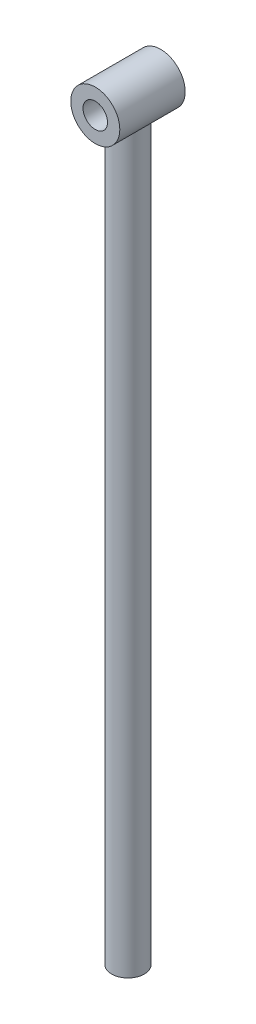
ISO-10303-21;
HEADER;
FILE_DESCRIPTION(('STEP AP214'),'2;1');
FILE_NAME('part.step','',(''),(''),'','','');
FILE_SCHEMA(('AUTOMOTIVE_DESIGN { 1 0 10303 214 1 1 1 1 }'));
ENDSEC;
DATA;
#1=APPLICATION_CONTEXT('core data for automotive mechanical design processes');
#2=APPLICATION_PROTOCOL_DEFINITION('international standard','automotive_design',2000,#1);
#3=PRODUCT_CONTEXT('',#1,'mechanical');
#4=PRODUCT('Part','Part','',(#3));
#5=PRODUCT_RELATED_PRODUCT_CATEGORY('part','',(#4));
#6=PRODUCT_DEFINITION_FORMATION('','',#4);
#7=PRODUCT_DEFINITION_CONTEXT('part definition',#1,'design');
#8=PRODUCT_DEFINITION('design','',#6,#7);
#9=PRODUCT_DEFINITION_SHAPE('','',#8);
#10=(LENGTH_UNIT() NAMED_UNIT(*) SI_UNIT(.MILLI.,.METRE.));
#11=(NAMED_UNIT(*) PLANE_ANGLE_UNIT() SI_UNIT($,.RADIAN.));
#12=(NAMED_UNIT(*) SI_UNIT($,.STERADIAN.) SOLID_ANGLE_UNIT());
#13=UNCERTAINTY_MEASURE_WITH_UNIT(LENGTH_MEASURE(1.E-05),#10,'distance_accuracy_value','');
#14=(GEOMETRIC_REPRESENTATION_CONTEXT(3) GLOBAL_UNCERTAINTY_ASSIGNED_CONTEXT((#13)) GLOBAL_UNIT_ASSIGNED_CONTEXT((#10,
#11,#12)) REPRESENTATION_CONTEXT('',''));
#15=CARTESIAN_POINT('',(0.,0.,0.));
#16=DIRECTION('',(0.,0.,1.));
#17=DIRECTION('',(1.,0.,0.));
#18=AXIS2_PLACEMENT_3D('',#15,#16,#17);
#19=CARTESIAN_POINT('',(0.,0.,40.));
#20=DIRECTION('',(0.,0.,-1.));
#21=DIRECTION('',(-1.,0.,0.));
#22=AXIS2_PLACEMENT_3D('',#19,#20,#21);
#23=CYLINDRICAL_SURFACE('',#22,30.);
#24=CARTESIAN_POINT('',(0.,0.,40.));
#25=DIRECTION('',(0.,0.,1.));
#26=DIRECTION('',(1.,0.,0.));
#27=AXIS2_PLACEMENT_3D('',#24,#25,#26);
#28=CIRCLE('',#27,30.);
#29=CARTESIAN_POINT('',(30.,0.,40.));
#30=VERTEX_POINT('',#29);
#31=EDGE_CURVE('E46',#30,#30,#28,.T.);
#32=ORIENTED_EDGE('',*,*,#31,.F.);
#33=EDGE_LOOP('',(#32));
#34=FACE_BOUND('',#33,.T.);
#35=CARTESIAN_POINT('',(0.,0.,-40.));
#36=DIRECTION('',(0.,0.,1.));
#37=DIRECTION('',(1.,0.,0.));
#38=AXIS2_PLACEMENT_3D('',#35,#36,#37);
#39=CIRCLE('',#38,30.);
#40=CARTESIAN_POINT('',(30.,0.,-40.));
#41=VERTEX_POINT('',#40);
#42=EDGE_CURVE('E50',#41,#41,#39,.T.);
#43=ORIENTED_EDGE('',*,*,#42,.T.);
#44=EDGE_LOOP('',(#43));
#45=FACE_BOUND('',#44,.T.);
#46=CARTESIAN_POINT('',(0.,-30.,-20.));
#47=CARTESIAN_POINT('',(0.502432050357106,-29.9999998661981,-19.9999998708156));
#48=CARTESIAN_POINT('',(1.00486659291617,-29.9873512767924,-19.981041890221));
#49=CARTESIAN_POINT('',(2.00562861223446,-29.9370754507124,-19.9055087079442));
#50=CARTESIAN_POINT('',(2.50395606736271,-29.8994480825663,-19.8489333082686));
#51=CARTESIAN_POINT('',(3.49278874290095,-29.8001252135495,-19.6990002879968));
#52=CARTESIAN_POINT('',(3.98329083644028,-29.7384203306489,-19.6056283291341));
#53=CARTESIAN_POINT('',(4.9527367018995,-29.5924098661005,-19.3834395211629));
#54=CARTESIAN_POINT('',(5.43168033398314,-29.5081040111715,-19.2546222434644));
#55=CARTESIAN_POINT('',(6.3726831529905,-29.3192451350848,-18.9639204802124));
#56=CARTESIAN_POINT('',(6.83481207132658,-29.2147907649452,-18.8021969068242));
#57=CARTESIAN_POINT('',(7.74207070686117,-28.987567335659,-18.4471586375469));
#58=CARTESIAN_POINT('',(8.18720051199242,-28.864798371266,-18.2538441050984));
#59=CARTESIAN_POINT('',(9.05844037609498,-28.6033482003015,-17.8375381124749));
#60=CARTESIAN_POINT('',(9.48455105472426,-28.4646675126729,-17.6145476201097));
#61=CARTESIAN_POINT('',(10.3162415378409,-28.1739113247129,-17.1407197895657));
#62=CARTESIAN_POINT('',(10.7218189133778,-28.0218342454824,-16.88987916806));
#63=CARTESIAN_POINT('',(11.544666651525,-27.6935578417576,-16.3397046695659));
#64=CARTESIAN_POINT('',(11.9600134544702,-27.5164065024113,-16.0380625153589));
#65=CARTESIAN_POINT('',(12.7638755092378,-27.1528656210948,-15.4060039283267));
#66=CARTESIAN_POINT('',(13.1523895414017,-26.9664756598522,-15.0755861890756));
#67=CARTESIAN_POINT('',(13.9021114634373,-26.5877396332004,-14.3871695519229));
#68=CARTESIAN_POINT('',(14.2632822184455,-26.3953859507486,-14.0291344326562));
#69=CARTESIAN_POINT('',(14.9568597365416,-26.0086530551827,-13.2872215493219));
#70=CARTESIAN_POINT('',(15.2892647981446,-25.8142737230126,-12.9033422589614));
#71=CARTESIAN_POINT('',(15.9745417178036,-25.396836648899,-12.0482275933553));
#72=CARTESIAN_POINT('',(16.3223586443349,-25.174096536266,-11.5727693191127));
#73=CARTESIAN_POINT('',(16.9764877633748,-24.7376939344548,-10.5899657994356));
#74=CARTESIAN_POINT('',(17.2827905315006,-24.5240335140448,-10.0826133516483));
#75=CARTESIAN_POINT('',(17.8511644026812,-24.1134541975624,-9.03819236671138));
#76=CARTESIAN_POINT('',(18.1132955295477,-23.9165127661255,-8.50116549380746));
#77=CARTESIAN_POINT('',(18.5908454263022,-23.5472211433069,-7.39870988362545));
#78=CARTESIAN_POINT('',(18.8062866319954,-23.3748591544978,-6.83329494920044));
#79=CARTESIAN_POINT('',(19.13202887715,-23.1083554699939,-5.84404921175392));
#80=CARTESIAN_POINT('',(19.254726201792,-23.0059988256492,-5.42648017350507));
#81=CARTESIAN_POINT('',(19.4734126020971,-22.8211903176783,-4.58008091505704));
#82=CARTESIAN_POINT('',(19.5694060373963,-22.7387352052499,-4.15125254556425));
#83=CARTESIAN_POINT('',(19.7332623242764,-22.5966842761104,-3.28516192271635));
#84=CARTESIAN_POINT('',(19.8011667190628,-22.5370547106277,-2.84791313270977));
#85=CARTESIAN_POINT('',(19.9079619855319,-22.442775186748,-1.9671774710335));
#86=CARTESIAN_POINT('',(19.9468526982109,-22.4081253652476,-1.52369056519061));
#87=CARTESIAN_POINT('',(19.995018995311,-22.3651578047493,-0.631973802665968));
#88=CARTESIAN_POINT('',(20.0041712760879,-22.3569497015249,-0.18373191026744));
#89=CARTESIAN_POINT('',(19.9923398271623,-22.3675301691013,0.71203065874045));
#90=CARTESIAN_POINT('',(19.971355995093,-22.3863188316053,1.1595513328948));
#91=CARTESIAN_POINT('',(19.8996205096492,-22.4501086857203,2.05062509539199));
#92=CARTESIAN_POINT('',(19.8488467375743,-22.4951293541334,2.49417498677211));
#93=CARTESIAN_POINT('',(19.7184018881212,-22.6095581655225,3.37377492739302));
#94=CARTESIAN_POINT('',(19.6387302596127,-22.6789667736164,3.80982483343044));
#95=CARTESIAN_POINT('',(19.4558684710411,-22.8360020403641,4.6526059950737));
#96=CARTESIAN_POINT('',(19.3538839737256,-22.9226794986437,5.05977803330655));
#97=CARTESIAN_POINT('',(19.1258219416928,-23.1133089528256,5.86323587316173));
#98=CARTESIAN_POINT('',(18.9997350845369,-23.2172676308142,6.2595173944349));
#99=CARTESIAN_POINT('',(18.5870898788948,-23.5509005263236,7.42993067111852));
#100=CARTESIAN_POINT('',(18.2660472919538,-23.8024209013306,8.18608179416506));
#101=CARTESIAN_POINT('',(17.6854431992285,-24.2342569329526,9.35228726673065));
#102=CARTESIAN_POINT('',(17.4522559964646,-24.4030773177829,9.78032481496438));
#103=CARTESIAN_POINT('',(16.9570483876589,-24.7497432705651,10.6157476442302));
#104=CARTESIAN_POINT('',(16.6950252280375,-24.9275896995493,11.023130947529));
#105=CARTESIAN_POINT('',(16.1430567151301,-25.2885468949722,11.8167546644321));
#106=CARTESIAN_POINT('',(15.8530809594392,-25.4716632378859,12.2029713238621));
#107=CARTESIAN_POINT('',(15.246358714758,-25.8393965051977,12.9530389311316));
#108=CARTESIAN_POINT('',(14.9296104475491,-26.024013528533,13.3168883905748));
#109=CARTESIAN_POINT('',(14.1989483888887,-26.4310497738323,14.097303197129));
#110=CARTESIAN_POINT('',(13.7788159652825,-26.6530303956695,14.508303367811));
#111=CARTESIAN_POINT('',(12.9014676729698,-27.0885965336176,15.2937513429521));
#112=CARTESIAN_POINT('',(12.4442450060577,-27.3021805000215,15.6681924187186));
#113=CARTESIAN_POINT('',(11.4946861176089,-27.7153401348638,16.3775183221479));
#114=CARTESIAN_POINT('',(11.0023760522687,-27.9149260225621,16.7124321311584));
#115=CARTESIAN_POINT('',(9.98447354240782,-28.2949676279155,17.3397652164746));
#116=CARTESIAN_POINT('',(9.45889031296224,-28.4754286055529,17.6321961852127));
#117=CARTESIAN_POINT('',(8.48334612274972,-28.7791644068812,18.1181905483136));
#118=CARTESIAN_POINT('',(8.03875717640118,-28.9067147978732,18.3198975753372));
#119=CARTESIAN_POINT('',(7.13185034835577,-29.1437173052015,18.691623162803));
#120=CARTESIAN_POINT('',(6.66953454679111,-29.2531715370476,18.8616454276103));
#121=CARTESIAN_POINT('',(5.72992272771892,-29.4516277514227,19.1679937956703));
#122=CARTESIAN_POINT('',(5.25263701566195,-29.5406434674396,19.3043425302521));
#123=CARTESIAN_POINT('',(4.28575432400349,-29.6963305492252,19.5417523912564));
#124=CARTESIAN_POINT('',(3.79615715514138,-29.7630015712691,19.6428129748477));
#125=CARTESIAN_POINT('',(2.80597314349127,-29.872657894971,19.8085733139663));
#126=CARTESIAN_POINT('',(2.30534759903098,-29.9155383206477,19.8731120951364));
#127=CARTESIAN_POINT('',(1.29911991465959,-29.9760956021539,19.9641545523483));
#128=CARTESIAN_POINT('',(0.793517768246558,-29.9937724250504,19.9906581786905));
#129=CARTESIAN_POINT('',(-0.218464736427029,-30.0034717951189,20.0052080328604));
#130=CARTESIAN_POINT('',(-0.724845061752659,-29.9954953996663,19.9932558457618));
#131=CARTESIAN_POINT('',(-1.73418156784463,-29.9540933231667,19.931087455494));
#132=CARTESIAN_POINT('',(-2.23713789383012,-29.9206687283027,19.8808728854445));
#133=CARTESIAN_POINT('',(-3.20042176411033,-29.8324414506934,19.7478312691314));
#134=CARTESIAN_POINT('',(-3.66125811656818,-29.7793090042603,19.6675483452082));
#135=CARTESIAN_POINT('',(-4.57350157570509,-29.6529106481444,19.4756341111471));
#136=CARTESIAN_POINT('',(-5.02490921158323,-29.5796458717002,19.3640045654864));
#137=CARTESIAN_POINT('',(-5.91571607198156,-29.4144446665676,19.1106977521881));
#138=CARTESIAN_POINT('',(-6.35511451265424,-29.3225070223762,18.9690185284518));
#139=CARTESIAN_POINT('',(-7.21966385402623,-29.1217004947068,18.6571079304231));
#140=CARTESIAN_POINT('',(-7.64481399436504,-29.0128307093883,18.486875035266));
#141=CARTESIAN_POINT('',(-8.50426678457441,-28.7730488442419,18.1083152340667));
#142=CARTESIAN_POINT('',(-8.93756698372231,-28.641201691667,17.8983067263232));
#143=CARTESIAN_POINT('',(-9.78432512725704,-28.3631030211141,17.449829798643));
#144=CARTESIAN_POINT('',(-10.1977824740429,-28.2168510697156,17.2113605223155));
#145=CARTESIAN_POINT('',(-11.0036909497809,-27.9124418593605,16.7076242018634));
#146=CARTESIAN_POINT('',(-11.3961325988641,-27.7542793038351,16.442345217486));
#147=CARTESIAN_POINT('',(-12.1587990167243,-27.4287361682711,15.8866695617355));
#148=CARTESIAN_POINT('',(-12.529021301013,-27.2613545613898,15.5962700903114));
#149=CARTESIAN_POINT('',(-13.3031347178692,-26.8930879740092,14.9439528947196));
#150=CARTESIAN_POINT('',(-13.7030923841241,-26.6910905163229,14.5779874749765));
#151=CARTESIAN_POINT('',(-14.4709683638239,-26.2826982946006,13.8160664974289));
#152=CARTESIAN_POINT('',(-14.8388824217615,-26.0763029510259,13.4201069693141));
#153=CARTESIAN_POINT('',(-15.5417880165119,-25.6635739697582,12.5994023240134));
#154=CARTESIAN_POINT('',(-15.876757023597,-25.4572404691787,12.174637839138));
#155=CARTESIAN_POINT('',(-16.5122275702686,-25.0497261492331,11.2977646153286));
#156=CARTESIAN_POINT('',(-16.81273263041,-24.8485448051984,10.8456586765927));
#157=CARTESIAN_POINT('',(-17.3538627139578,-24.4733023029991,9.95448274755282));
#158=CARTESIAN_POINT('',(-17.5974024349064,-24.2983863656877,9.51754297050519));
#159=CARTESIAN_POINT('',(-18.0528546349536,-23.9619407246742,8.62244520074574));
#160=CARTESIAN_POINT('',(-18.2647666558762,-23.8004112149102,8.16428690077694));
#161=CARTESIAN_POINT('',(-18.6548371117046,-23.4959190621918,7.22866142786253));
#162=CARTESIAN_POINT('',(-18.8330449293941,-23.352929353255,6.75122376801287));
#163=CARTESIAN_POINT('',(-19.1539484457238,-23.0904591353035,5.7782748012995));
#164=CARTESIAN_POINT('',(-19.2966523056608,-22.9709732247938,5.28276767814734));
#165=CARTESIAN_POINT('',(-19.5220414226083,-22.7795445121488,4.36698264384054));
#166=CARTESIAN_POINT('',(-19.6109049179647,-22.7029160837044,3.94920001271947));
#167=CARTESIAN_POINT('',(-19.7620762933325,-22.5714513943609,3.10546869345641));
#168=CARTESIAN_POINT('',(-19.82438737206,-22.5166125085731,2.67952099540771));
#169=CARTESIAN_POINT('',(-19.9214537495162,-22.4307802243878,1.82249119082991));
#170=CARTESIAN_POINT('',(-19.9562344390175,-22.3997648547817,1.39141418836718));
#171=CARTESIAN_POINT('',(-19.9977438544737,-22.3627151772862,0.526818989046371));
#172=CARTESIAN_POINT('',(-20.0044721710347,-22.3566812339737,0.0933007566536421));
#173=CARTESIAN_POINT('',(-19.9897505651309,-22.3698449862022,-0.773115287328872));
#174=CARTESIAN_POINT('',(-19.9682845568072,-22.3890570855061,-1.20601260355542));
#175=CARTESIAN_POINT('',(-19.89752521375,-22.4519644396444,-2.06770261584202));
#176=CARTESIAN_POINT('',(-19.84823210714,-22.4956594937704,-2.49649534552169));
#177=CARTESIAN_POINT('',(-19.7225495457303,-22.6059284972836,-3.34758196945675));
#178=CARTESIAN_POINT('',(-19.6461292623078,-22.672528474229,-3.76986789699178));
#179=CARTESIAN_POINT('',(-19.4672984586528,-22.8262602119977,-4.60508117377621));
#180=CARTESIAN_POINT('',(-19.3648846001243,-22.9133946099072,-5.01800731354379));
#181=CARTESIAN_POINT('',(-19.1046848410163,-23.1310818906606,-5.94123169432081));
#182=CARTESIAN_POINT('',(-18.9394160062732,-23.2670175183132,-6.44816076864196));
#183=CARTESIAN_POINT('',(-18.5716220555324,-23.5616278122302,-7.44147650640457));
#184=CARTESIAN_POINT('',(-18.3690866697139,-23.7203087439171,-7.92785746170605));
#185=CARTESIAN_POINT('',(-17.928768029319,-24.0548494900776,-8.8788597841179));
#186=CARTESIAN_POINT('',(-17.6909470983742,-24.230727597647,-9.34345718517343));
#187=CARTESIAN_POINT('',(-17.1820850766219,-24.5941802563021,-10.2491849776675));
#188=CARTESIAN_POINT('',(-16.9110457402246,-24.781754189423,-10.6903166066737));
#189=CARTESIAN_POINT('',(-16.3319905343255,-25.1672255632098,-11.5560455039427));
#190=CARTESIAN_POINT('',(-16.0233924051234,-25.3652486390897,-11.9801968484712));
#191=CARTESIAN_POINT('',(-15.3745104302451,-25.7637225763061,-12.8022908705141));
#192=CARTESIAN_POINT('',(-15.03422666181,-25.9641734317233,-13.200233611914));
#193=CARTESIAN_POINT('',(-14.3228973596636,-26.3632502502894,-13.9688530344093));
#194=CARTESIAN_POINT('',(-13.951843028237,-26.5618756733661,-14.33952185996));
#195=CARTESIAN_POINT('',(-13.180017889376,-26.9531887772778,-15.0520096270216));
#196=CARTESIAN_POINT('',(-12.7792446136651,-27.1458759630328,-15.3938261671826));
#197=CARTESIAN_POINT('',(-11.88929534125,-27.5484327444244,-16.0937728405199));
#198=CARTESIAN_POINT('',(-11.3956949938792,-27.7567878541468,-16.4471788212645));
#199=CARTESIAN_POINT('',(-10.3729470334891,-28.1549839321458,-17.1106254017982));
#200=CARTESIAN_POINT('',(-9.84379425458727,-28.3448221999976,-17.42065967928));
#201=CARTESIAN_POINT('',(-8.75345833781631,-28.7002669540513,-17.9932104380746));
#202=CARTESIAN_POINT('',(-8.19231563994948,-28.8659031307225,-18.2557852367735));
#203=CARTESIAN_POINT('',(-7.04137086874955,-29.1680076078479,-18.7298173077689));
#204=CARTESIAN_POINT('',(-6.45157894748344,-29.3044861493112,-18.941292531152));
#205=CARTESIAN_POINT('',(-5.3822275165873,-29.5171038312657,-19.2683981125324));
#206=CARTESIAN_POINT('',(-4.90728446450016,-29.5999120726272,-19.3948839484347));
#207=CARTESIAN_POINT('',(-3.94618639128293,-29.7432935523992,-19.6130133782002));
#208=CARTESIAN_POINT('',(-3.46003319276104,-29.8038703786017,-19.7046625942176));
#209=CARTESIAN_POINT('',(-2.48023551916963,-29.9013488891663,-19.8517933612465));
#210=CARTESIAN_POINT('',(-1.98659585428407,-29.9382651667603,-19.9072972061548));
#211=CARTESIAN_POINT('',(-0.99530504111739,-29.9875912480541,-19.9814012816267));
#212=CARTESIAN_POINT('',(-0.497653743070653,-30.0000001325294,-20.0000001279558));
#213=CARTESIAN_POINT('',(0.,-30.,-20.));
#214=B_SPLINE_CURVE_WITH_KNOTS('',3,(#46,#47,#48,#49,#50,#51,#52,#53,#54,#55,#56,#57,#58,#59,
#60,#61,#62,#63,#64,#65,#66,#67,#68,#69,#70,#71,#72,#73,#74,#75,#76,#77,#78,#79,#80,#81,#82,#83,
#84,#85,#86,#87,#88,#89,#90,#91,#92,#93,#94,#95,#96,#97,#98,#99,#100,#101,#102,#103,#104,#105,
#106,#107,#108,#109,#110,#111,#112,#113,#114,#115,#116,#117,#118,#119,#120,#121,#122,#123,#124,
#125,#126,#127,#128,#129,#130,#131,#132,#133,#134,#135,#136,#137,#138,#139,#140,#141,#142,#143,
#144,#145,#146,#147,#148,#149,#150,#151,#152,#153,#154,#155,#156,#157,#158,#159,#160,#161,#162,
#163,#164,#165,#166,#167,#168,#169,#170,#171,#172,#173,#174,#175,#176,#177,#178,#179,#180,#181,
#182,#183,#184,#185,#186,#187,#188,#189,#190,#191,#192,#193,#194,#195,#196,#197,#198,#199,#200,
#201,#202,#203,#204,#205,#206,#207,#208,#209,#210,#211,#212,#213),.UNSPECIFIED.,.T.,.F.,(4,2,2,
2,2,2,2,2,2,2,2,2,2,2,2,2,2,2,2,2,2,2,2,2,2,2,2,2,2,2,2,2,2,2,2,2,2,2,2,2,2,2,2,2,2,2,2,2,2,2,2,
2,2,2,2,2,2,2,2,2,2,2,2,2,2,2,2,2,2,2,2,2,2,2,2,2,2,2,2,2,2,2,2,4),(0.,1.50678860030269,
3.01358513141217,4.52096938721657,6.02837187047945,7.52857302893605,9.02876642612416,
10.5289109101103,12.0292324383504,13.6567444840869,15.284330458243,16.9140886133164,
18.5439431024577,20.431131930561,22.3187484658921,24.2037789087041,26.0879015235946,
27.4279650999174,28.7678097709498,30.1056656880386,31.4435289369311,32.7869323000986,
34.1303402265693,35.4747468830929,36.8191791810432,38.1037263431644,39.3887713582513,
41.9574635192447,43.5039572638651,45.0505988133526,46.5989419535985,48.1473880150574,
50.0299431140749,51.9128440463345,53.7943557465543,55.6753486185391,57.1876211138397,
58.6997166935429,60.2107932404063,61.7218930308516,63.2396023156496,64.7573135836024,
66.2749622952646,67.7925462340977,69.2033177886316,70.6140099478306,72.0247939649323,
73.4356531490233,74.9318700392892,76.4281319624119,77.9250632379934,79.4221615843148,
81.1559974776003,82.8900632805819,84.6253068106234,86.3603729242012,87.9487273830718,
89.5371048494666,91.1231367124567,92.7088036566569,94.0093258243475,95.3096912764256,
96.6088560233589,97.9080397301251,99.2079649891922,100.507879591774,101.809276234171,
103.110840096639,104.759184673476,106.407984179069,108.058557042328,109.70904276911,
111.389510486188,113.069974106853,114.750919862111,116.432005383304,118.354868197109,
120.278011015838,122.198774401875,124.118862046836,125.61242765333,127.105752116314,
128.598154645697,130.090613151129),.UNSPECIFIED.);
#215=CARTESIAN_POINT('',(0.,-30.,-20.));
#216=VERTEX_POINT('',#215);
#217=EDGE_CURVE('E10',#216,#216,#214,.T.);
#218=ORIENTED_EDGE('',*,*,#217,.F.);
#219=EDGE_LOOP('',(#218));
#220=FACE_BOUND('',#219,.T.);
#221=ADVANCED_FACE('F35',(#34,#45,#220),#23,.T.);
#222=CARTESIAN_POINT('',(0.,0.,40.));
#223=DIRECTION('',(0.,0.,1.));
#224=DIRECTION('',(1.,0.,0.));
#225=AXIS2_PLACEMENT_3D('',#222,#223,#224);
#226=PLANE('',#225);
#227=ORIENTED_EDGE('',*,*,#31,.T.);
#228=EDGE_LOOP('',(#227));
#229=FACE_BOUND('',#228,.T.);
#230=CARTESIAN_POINT('',(0.,0.,40.));
#231=DIRECTION('',(0.,0.,1.));
#232=DIRECTION('',(1.,0.,0.));
#233=AXIS2_PLACEMENT_3D('',#230,#231,#232);
#234=CIRCLE('',#233,15.);
#235=CARTESIAN_POINT('',(15.,0.,40.));
#236=VERTEX_POINT('',#235);
#237=EDGE_CURVE('E55',#236,#236,#234,.T.);
#238=ORIENTED_EDGE('',*,*,#237,.F.);
#239=EDGE_LOOP('',(#238));
#240=FACE_BOUND('',#239,.T.);
#241=ADVANCED_FACE('F80',(#229,#240),#226,.T.);
#242=CARTESIAN_POINT('',(0.,0.,-40.));
#243=DIRECTION('',(0.,0.,1.));
#244=DIRECTION('',(1.,0.,0.));
#245=AXIS2_PLACEMENT_3D('',#242,#243,#244);
#246=PLANE('',#245);
#247=ORIENTED_EDGE('',*,*,#42,.F.);
#248=EDGE_LOOP('',(#247));
#249=FACE_BOUND('',#248,.T.);
#250=CARTESIAN_POINT('',(0.,0.,-40.));
#251=DIRECTION('',(0.,0.,1.));
#252=DIRECTION('',(1.,0.,0.));
#253=AXIS2_PLACEMENT_3D('',#250,#251,#252);
#254=CIRCLE('',#253,15.);
#255=CARTESIAN_POINT('',(15.,0.,-40.));
#256=VERTEX_POINT('',#255);
#257=EDGE_CURVE('E57',#256,#256,#254,.T.);
#258=ORIENTED_EDGE('',*,*,#257,.T.);
#259=EDGE_LOOP('',(#258));
#260=FACE_BOUND('',#259,.T.);
#261=ADVANCED_FACE('F76',(#249,#260),#246,.F.);
#262=CARTESIAN_POINT('',(0.,0.,40.));
#263=DIRECTION('',(0.,0.,-1.));
#264=DIRECTION('',(-1.,0.,0.));
#265=AXIS2_PLACEMENT_3D('',#262,#263,#264);
#266=CYLINDRICAL_SURFACE('',#265,15.);
#267=ORIENTED_EDGE('',*,*,#237,.T.);
#268=EDGE_LOOP('',(#267));
#269=FACE_BOUND('',#268,.T.);
#270=ORIENTED_EDGE('',*,*,#257,.F.);
#271=EDGE_LOOP('',(#270));
#272=FACE_BOUND('',#271,.T.);
#273=ADVANCED_FACE('F70',(#269,#272),#266,.F.);
#274=CARTESIAN_POINT('',(0.,-920.,0.));
#275=DIRECTION('',(0.,1.,0.));
#276=DIRECTION('',(0.,0.,1.));
#277=AXIS2_PLACEMENT_3D('',#274,#275,#276);
#278=PLANE('',#277);
#279=CARTESIAN_POINT('',(0.,-920.,0.));
#280=DIRECTION('',(0.,1.,0.));
#281=DIRECTION('',(0.,0.,1.));
#282=AXIS2_PLACEMENT_3D('',#279,#280,#281);
#283=CIRCLE('',#282,20.);
#284=CARTESIAN_POINT('',(0.,-920.,20.));
#285=VERTEX_POINT('',#284);
#286=EDGE_CURVE('E60',#285,#285,#283,.T.);
#287=ORIENTED_EDGE('',*,*,#286,.F.);
#288=EDGE_LOOP('',(#287));
#289=FACE_BOUND('',#288,.T.);
#290=ADVANCED_FACE('F68',(#289),#278,.F.);
#291=CARTESIAN_POINT('',(0.,30.0010000000001,0.));
#292=DIRECTION('',(0.,-1.,0.));
#293=DIRECTION('',(0.,0.,-1.));
#294=AXIS2_PLACEMENT_3D('',#291,#292,#293);
#295=CYLINDRICAL_SURFACE('',#294,20.);
#296=ORIENTED_EDGE('',*,*,#286,.T.);
#297=EDGE_LOOP('',(#296));
#298=FACE_BOUND('',#297,.T.);
#299=ORIENTED_EDGE('',*,*,#217,.T.);
#300=EDGE_LOOP('',(#299));
#301=FACE_BOUND('',#300,.T.);
#302=ADVANCED_FACE('F66',(#298,#301),#295,.T.);
#303=CLOSED_SHELL('',(#221,#241,#261,#273,#290,#302));
#304=MANIFOLD_SOLID_BREP('B2',#303);
#305=ADVANCED_BREP_SHAPE_REPRESENTATION('',(#18,#304),#14);
#306=SHAPE_DEFINITION_REPRESENTATION(#9,#305);
ENDSEC;
END-ISO-10303-21;
